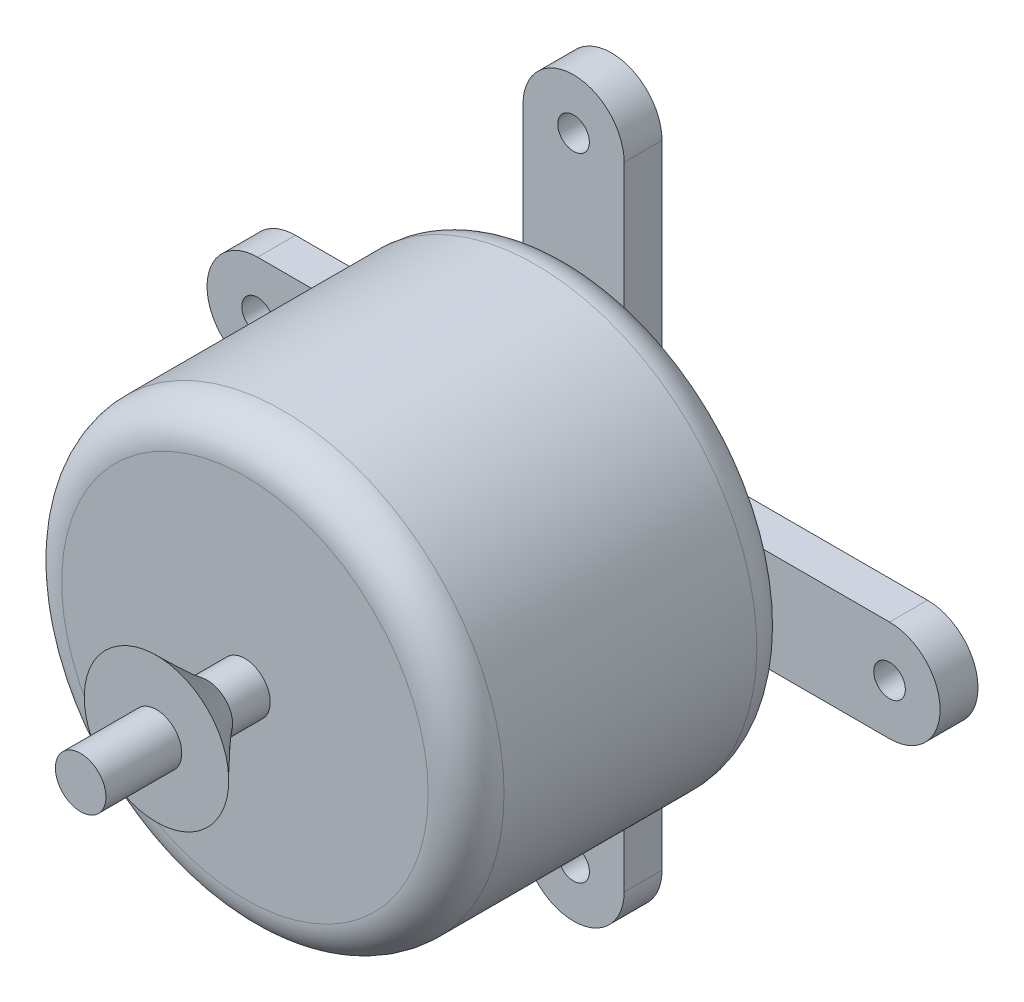
ISO-10303-21;
HEADER;
FILE_DESCRIPTION(('STEP AP214'),'2;1');
FILE_NAME('part.step','',(''),(''),'','','');
FILE_SCHEMA(('AUTOMOTIVE_DESIGN { 1 0 10303 214 1 1 1 1 }'));
ENDSEC;
DATA;
#1=APPLICATION_CONTEXT('core data for automotive mechanical design processes');
#2=APPLICATION_PROTOCOL_DEFINITION('international standard','automotive_design',2000,#1);
#3=PRODUCT_CONTEXT('',#1,'mechanical');
#4=PRODUCT('Part','Part','',(#3));
#5=PRODUCT_RELATED_PRODUCT_CATEGORY('part','',(#4));
#6=PRODUCT_DEFINITION_FORMATION('','',#4);
#7=PRODUCT_DEFINITION_CONTEXT('part definition',#1,'design');
#8=PRODUCT_DEFINITION('design','',#6,#7);
#9=PRODUCT_DEFINITION_SHAPE('','',#8);
#10=(LENGTH_UNIT() NAMED_UNIT(*) SI_UNIT(.MILLI.,.METRE.));
#11=(NAMED_UNIT(*) PLANE_ANGLE_UNIT() SI_UNIT($,.RADIAN.));
#12=(NAMED_UNIT(*) SI_UNIT($,.STERADIAN.) SOLID_ANGLE_UNIT());
#13=UNCERTAINTY_MEASURE_WITH_UNIT(LENGTH_MEASURE(1.E-05),#10,'distance_accuracy_value','');
#14=(GEOMETRIC_REPRESENTATION_CONTEXT(3) GLOBAL_UNCERTAINTY_ASSIGNED_CONTEXT((#13)) GLOBAL_UNIT_ASSIGNED_CONTEXT((#10,
#11,#12)) REPRESENTATION_CONTEXT('',''));
#15=CARTESIAN_POINT('',(0.,0.,0.));
#16=DIRECTION('',(0.,0.,1.));
#17=DIRECTION('',(1.,0.,0.));
#18=AXIS2_PLACEMENT_3D('',#15,#16,#17);
#19=CARTESIAN_POINT('',(0.,0.,0.));
#20=DIRECTION('',(0.,0.,1.));
#21=DIRECTION('',(1.,0.,0.));
#22=AXIS2_PLACEMENT_3D('',#19,#20,#21);
#23=PLANE('',#22);
#24=DIRECTION('',(-1.,0.,0.));
#25=VECTOR('',#24,1.);
#26=CARTESIAN_POINT('',(0.,-4.,0.));
#27=LINE('',#26,#25);
#28=CARTESIAN_POINT('',(-4.,-4.,0.));
#29=VERTEX_POINT('',#28);
#30=CARTESIAN_POINT('',(-13.9373598647664,-4.,0.));
#31=VERTEX_POINT('',#30);
#32=EDGE_CURVE('E184',#29,#31,#27,.T.);
#33=ORIENTED_EDGE('',*,*,#32,.F.);
#34=DIRECTION('',(0.,1.,0.));
#35=VECTOR('',#34,1.);
#36=CARTESIAN_POINT('',(-4.,0.,0.));
#37=LINE('',#36,#35);
#38=CARTESIAN_POINT('',(-4.,-13.9373598647664,0.));
#39=VERTEX_POINT('',#38);
#40=EDGE_CURVE('E272',#39,#29,#37,.T.);
#41=ORIENTED_EDGE('',*,*,#40,.F.);
#42=CARTESIAN_POINT('',(0.,0.,0.));
#43=DIRECTION('',(0.,0.,1.));
#44=DIRECTION('',(1.,0.,0.));
#45=AXIS2_PLACEMENT_3D('',#42,#43,#44);
#46=CIRCLE('',#45,14.5);
#47=EDGE_CURVE('E342',#39,#31,#46,.F.);
#48=ORIENTED_EDGE('',*,*,#47,.T.);
#49=EDGE_LOOP('',(#33,#41,#48));
#50=FACE_BOUND('',#49,.T.);
#51=ADVANCED_FACE('F39',(#50),#23,.F.);
#52=DIRECTION('',(1.,0.,0.));
#53=VECTOR('',#52,1.);
#54=CARTESIAN_POINT('',(0.,4.,0.));
#55=LINE('',#54,#53);
#56=CARTESIAN_POINT('',(-13.9373598647664,4.,0.));
#57=VERTEX_POINT('',#56);
#58=CARTESIAN_POINT('',(-4.,4.,0.));
#59=VERTEX_POINT('',#58);
#60=EDGE_CURVE('E54',#57,#59,#55,.T.);
#61=ORIENTED_EDGE('',*,*,#60,.F.);
#62=CARTESIAN_POINT('',(-4.,13.9373598647664,0.));
#63=VERTEX_POINT('',#62);
#64=EDGE_CURVE('E343',#57,#63,#46,.F.);
#65=ORIENTED_EDGE('',*,*,#64,.T.);
#66=EDGE_CURVE('E268',#59,#63,#37,.T.);
#67=ORIENTED_EDGE('',*,*,#66,.F.);
#68=EDGE_LOOP('',(#61,#65,#67));
#69=FACE_BOUND('',#68,.T.);
#70=ADVANCED_FACE('F366',(#69),#23,.F.);
#71=CARTESIAN_POINT('',(-4.,0.,-3.));
#72=DIRECTION('',(1.,0.,0.));
#73=DIRECTION('',(0.,1.,0.));
#74=AXIS2_PLACEMENT_3D('',#71,#72,#73);
#75=PLANE('',#74);
#76=DIRECTION('',(0.,0.,1.));
#77=VECTOR('',#76,1.);
#78=CARTESIAN_POINT('',(-4.,-4.,-3.));
#79=LINE('',#78,#77);
#80=CARTESIAN_POINT('',(-4.,-4.,-3.));
#81=VERTEX_POINT('',#80);
#82=EDGE_CURVE('E12',#81,#29,#79,.T.);
#83=ORIENTED_EDGE('',*,*,#82,.F.);
#84=DIRECTION('',(0.,1.,0.));
#85=VECTOR('',#84,1.);
#86=CARTESIAN_POINT('',(-4.,0.,-3.));
#87=LINE('',#86,#85);
#88=CARTESIAN_POINT('',(-4.,-25.,-3.));
#89=VERTEX_POINT('',#88);
#90=EDGE_CURVE('E160',#89,#81,#87,.T.);
#91=ORIENTED_EDGE('',*,*,#90,.F.);
#92=DIRECTION('',(0.,0.,1.));
#93=VECTOR('',#92,1.);
#94=CARTESIAN_POINT('',(-4.,-25.,-3.));
#95=LINE('',#94,#93);
#96=CARTESIAN_POINT('',(-4.,-25.,0.));
#97=VERTEX_POINT('',#96);
#98=EDGE_CURVE('E261',#89,#97,#95,.T.);
#99=ORIENTED_EDGE('',*,*,#98,.T.);
#100=EDGE_CURVE('E269',#97,#39,#37,.T.);
#101=ORIENTED_EDGE('',*,*,#100,.T.);
#102=ORIENTED_EDGE('',*,*,#40,.T.);
#103=EDGE_LOOP('',(#83,#91,#99,#101,#102));
#104=FACE_BOUND('',#103,.T.);
#105=ADVANCED_FACE('F370',(#104),#75,.F.);
#106=DIRECTION('',(0.,0.,-1.));
#107=VECTOR('',#106,1.);
#108=CARTESIAN_POINT('',(-4.,4.,-3.));
#109=LINE('',#108,#107);
#110=CARTESIAN_POINT('',(-4.,4.,-3.));
#111=VERTEX_POINT('',#110);
#112=EDGE_CURVE('E47',#59,#111,#109,.T.);
#113=ORIENTED_EDGE('',*,*,#112,.F.);
#114=ORIENTED_EDGE('',*,*,#66,.T.);
#115=DIRECTION('',(0.,1.,0.));
#116=VECTOR('',#115,1.);
#117=CARTESIAN_POINT('',(-4.,0.,0.));
#118=LINE('',#117,#116);
#119=CARTESIAN_POINT('',(-4.,25.,0.));
#120=VERTEX_POINT('',#119);
#121=EDGE_CURVE('E226',#63,#120,#118,.T.);
#122=ORIENTED_EDGE('',*,*,#121,.T.);
#123=DIRECTION('',(0.,0.,1.));
#124=VECTOR('',#123,1.);
#125=CARTESIAN_POINT('',(-4.,25.,-3.));
#126=LINE('',#125,#124);
#127=CARTESIAN_POINT('',(-4.,25.,-3.));
#128=VERTEX_POINT('',#127);
#129=EDGE_CURVE('E241',#128,#120,#126,.T.);
#130=ORIENTED_EDGE('',*,*,#129,.F.);
#131=EDGE_CURVE('E259',#111,#128,#87,.T.);
#132=ORIENTED_EDGE('',*,*,#131,.F.);
#133=EDGE_LOOP('',(#113,#114,#122,#130,#132));
#134=FACE_BOUND('',#133,.T.);
#135=ADVANCED_FACE('F363',(#134),#75,.F.);
#136=DIRECTION('',(1.,0.,0.));
#137=VECTOR('',#136,1.);
#138=CARTESIAN_POINT('',(0.,4.,0.));
#139=LINE('',#138,#137);
#140=CARTESIAN_POINT('',(4.,4.,0.));
#141=VERTEX_POINT('',#140);
#142=CARTESIAN_POINT('',(13.9373598647664,4.,0.));
#143=VERTEX_POINT('',#142);
#144=EDGE_CURVE('E208',#141,#143,#139,.T.);
#145=ORIENTED_EDGE('',*,*,#144,.F.);
#146=DIRECTION('',(0.,-1.,0.));
#147=VECTOR('',#146,1.);
#148=CARTESIAN_POINT('',(4.,0.,0.));
#149=LINE('',#148,#147);
#150=CARTESIAN_POINT('',(4.,13.9373598647664,0.));
#151=VERTEX_POINT('',#150);
#152=EDGE_CURVE('E262',#151,#141,#149,.T.);
#153=ORIENTED_EDGE('',*,*,#152,.F.);
#154=EDGE_CURVE('E374',#151,#143,#46,.F.);
#155=ORIENTED_EDGE('',*,*,#154,.T.);
#156=EDGE_LOOP('',(#145,#153,#155));
#157=FACE_BOUND('',#156,.T.);
#158=ADVANCED_FACE('F399',(#157),#23,.F.);
#159=DIRECTION('',(-1.,0.,0.));
#160=VECTOR('',#159,1.);
#161=CARTESIAN_POINT('',(0.,-4.,0.));
#162=LINE('',#161,#160);
#163=CARTESIAN_POINT('',(13.9373598647664,-4.,0.));
#164=VERTEX_POINT('',#163);
#165=CARTESIAN_POINT('',(4.,-4.,0.));
#166=VERTEX_POINT('',#165);
#167=EDGE_CURVE('E211',#164,#166,#162,.T.);
#168=ORIENTED_EDGE('',*,*,#167,.F.);
#169=CARTESIAN_POINT('',(4.,-13.9373598647664,0.));
#170=VERTEX_POINT('',#169);
#171=EDGE_CURVE('E337',#164,#170,#46,.F.);
#172=ORIENTED_EDGE('',*,*,#171,.T.);
#173=EDGE_CURVE('E266',#166,#170,#149,.T.);
#174=ORIENTED_EDGE('',*,*,#173,.F.);
#175=EDGE_LOOP('',(#168,#172,#174));
#176=FACE_BOUND('',#175,.T.);
#177=ADVANCED_FACE('F395',(#176),#23,.F.);
#178=CARTESIAN_POINT('',(4.,0.,-3.));
#179=DIRECTION('',(-1.,0.,0.));
#180=DIRECTION('',(0.,-1.,0.));
#181=AXIS2_PLACEMENT_3D('',#178,#179,#180);
#182=PLANE('',#181);
#183=DIRECTION('',(0.,0.,1.));
#184=VECTOR('',#183,1.);
#185=CARTESIAN_POINT('',(4.,4.,-3.));
#186=LINE('',#185,#184);
#187=CARTESIAN_POINT('',(4.,4.,-3.));
#188=VERTEX_POINT('',#187);
#189=EDGE_CURVE('E355',#188,#141,#186,.T.);
#190=ORIENTED_EDGE('',*,*,#189,.F.);
#191=DIRECTION('',(0.,-1.,0.));
#192=VECTOR('',#191,1.);
#193=CARTESIAN_POINT('',(4.,0.,-3.));
#194=LINE('',#193,#192);
#195=CARTESIAN_POINT('',(4.,25.,-3.));
#196=VERTEX_POINT('',#195);
#197=EDGE_CURVE('E254',#196,#188,#194,.T.);
#198=ORIENTED_EDGE('',*,*,#197,.F.);
#199=DIRECTION('',(0.,0.,1.));
#200=VECTOR('',#199,1.);
#201=CARTESIAN_POINT('',(4.,25.,-3.));
#202=LINE('',#201,#200);
#203=CARTESIAN_POINT('',(4.,25.,0.));
#204=VERTEX_POINT('',#203);
#205=EDGE_CURVE('E232',#196,#204,#202,.T.);
#206=ORIENTED_EDGE('',*,*,#205,.T.);
#207=DIRECTION('',(0.,-1.,0.));
#208=VECTOR('',#207,1.);
#209=CARTESIAN_POINT('',(4.,0.,0.));
#210=LINE('',#209,#208);
#211=EDGE_CURVE('E233',#204,#151,#210,.T.);
#212=ORIENTED_EDGE('',*,*,#211,.T.);
#213=ORIENTED_EDGE('',*,*,#152,.T.);
#214=EDGE_LOOP('',(#190,#198,#206,#212,#213));
#215=FACE_BOUND('',#214,.T.);
#216=ADVANCED_FACE('F402',(#215),#182,.F.);
#217=DIRECTION('',(0.,0.,-1.));
#218=VECTOR('',#217,1.);
#219=CARTESIAN_POINT('',(4.,-4.,-3.));
#220=LINE('',#219,#218);
#221=CARTESIAN_POINT('',(4.,-4.,-3.));
#222=VERTEX_POINT('',#221);
#223=EDGE_CURVE('E346',#166,#222,#220,.T.);
#224=ORIENTED_EDGE('',*,*,#223,.F.);
#225=ORIENTED_EDGE('',*,*,#173,.T.);
#226=CARTESIAN_POINT('',(4.,-25.,0.));
#227=VERTEX_POINT('',#226);
#228=EDGE_CURVE('E251',#170,#227,#149,.T.);
#229=ORIENTED_EDGE('',*,*,#228,.T.);
#230=DIRECTION('',(0.,0.,1.));
#231=VECTOR('',#230,1.);
#232=CARTESIAN_POINT('',(4.,-25.,-3.));
#233=LINE('',#232,#231);
#234=CARTESIAN_POINT('',(4.,-25.,-3.));
#235=VERTEX_POINT('',#234);
#236=EDGE_CURVE('E275',#235,#227,#233,.T.);
#237=ORIENTED_EDGE('',*,*,#236,.F.);
#238=EDGE_CURVE('E257',#222,#235,#194,.T.);
#239=ORIENTED_EDGE('',*,*,#238,.F.);
#240=EDGE_LOOP('',(#224,#225,#229,#237,#239));
#241=FACE_BOUND('',#240,.T.);
#242=ADVANCED_FACE('F408',(#241),#182,.F.);
#243=CARTESIAN_POINT('',(0.,0.,46.));
#244=DIRECTION('',(0.,0.,-1.));
#245=DIRECTION('',(-1.,0.,0.));
#246=AXIS2_PLACEMENT_3D('',#243,#244,#245);
#247=CYLINDRICAL_SURFACE('',#246,2.);
#248=CARTESIAN_POINT('',(0.,0.,33.));
#249=DIRECTION('',(0.,0.,1.));
#250=DIRECTION('',(1.,0.,0.));
#251=AXIS2_PLACEMENT_3D('',#248,#249,#250);
#252=CIRCLE('',#251,2.);
#253=CARTESIAN_POINT('',(2.,0.,33.));
#254=VERTEX_POINT('',#253);
#255=EDGE_CURVE('E331',#254,#254,#252,.T.);
#256=ORIENTED_EDGE('',*,*,#255,.T.);
#257=EDGE_LOOP('',(#256));
#258=FACE_BOUND('',#257,.T.);
#259=CARTESIAN_POINT('',(0.,0.,39.));
#260=DIRECTION('',(0.,0.,1.));
#261=DIRECTION('',(1.,0.,0.));
#262=AXIS2_PLACEMENT_3D('',#259,#260,#261);
#263=CIRCLE('',#262,2.);
#264=CARTESIAN_POINT('',(2.,0.,39.));
#265=VERTEX_POINT('',#264);
#266=EDGE_CURVE('E278',#265,#265,#263,.T.);
#267=ORIENTED_EDGE('',*,*,#266,.F.);
#268=EDGE_LOOP('',(#267));
#269=FACE_BOUND('',#268,.T.);
#270=ADVANCED_FACE('F516',(#258,#269),#247,.T.);
#271=CARTESIAN_POINT('',(0.,0.,26.));
#272=DIRECTION('',(0.,0.,1.));
#273=DIRECTION('',(1.,0.,0.));
#274=AXIS2_PLACEMENT_3D('',#271,#272,#273);
#275=PLANE('',#274);
#276=CARTESIAN_POINT('',(0.,0.,26.));
#277=DIRECTION('',(0.,0.,1.));
#278=DIRECTION('',(1.,0.,0.));
#279=AXIS2_PLACEMENT_3D('',#276,#277,#278);
#280=CIRCLE('',#279,14.5);
#281=CARTESIAN_POINT('',(14.5,0.,26.));
#282=VERTEX_POINT('',#281);
#283=EDGE_CURVE('E341',#282,#282,#280,.T.);
#284=ORIENTED_EDGE('',*,*,#283,.T.);
#285=EDGE_LOOP('',(#284));
#286=FACE_BOUND('',#285,.T.);
#287=CARTESIAN_POINT('',(0.,0.,26.));
#288=DIRECTION('',(0.,0.,1.));
#289=DIRECTION('',(1.,0.,0.));
#290=AXIS2_PLACEMENT_3D('',#287,#288,#289);
#291=CIRCLE('',#290,2.);
#292=CARTESIAN_POINT('',(2.,0.,26.));
#293=VERTEX_POINT('',#292);
#294=EDGE_CURVE('E327',#293,#293,#291,.T.);
#295=ORIENTED_EDGE('',*,*,#294,.F.);
#296=EDGE_LOOP('',(#295));
#297=FACE_BOUND('',#296,.T.);
#298=ADVANCED_FACE('F647',(#286,#297),#275,.T.);
#299=CARTESIAN_POINT('',(0.,0.,26.));
#300=DIRECTION('',(0.,0.,-1.));
#301=DIRECTION('',(-1.,0.,0.));
#302=AXIS2_PLACEMENT_3D('',#299,#300,#301);
#303=CYLINDRICAL_SURFACE('',#302,17.5);
#304=CARTESIAN_POINT('',(0.,0.,3.));
#305=DIRECTION('',(0.,0.,1.));
#306=DIRECTION('',(1.,0.,0.));
#307=AXIS2_PLACEMENT_3D('',#304,#305,#306);
#308=CIRCLE('',#307,17.5);
#309=CARTESIAN_POINT('',(-17.5,0.,3.));
#310=VERTEX_POINT('',#309);
#311=EDGE_CURVE('E334',#310,#310,#308,.T.);
#312=CARTESIAN_POINT('',(0.,0.,23.));
#313=DIRECTION('',(0.,0.,1.));
#314=DIRECTION('',(1.,0.,0.));
#315=AXIS2_PLACEMENT_3D('',#312,#313,#314);
#316=CIRCLE('',#315,17.5);
#317=CARTESIAN_POINT('',(-17.5,0.,23.));
#318=VERTEX_POINT('',#317);
#319=EDGE_CURVE('E330',#318,#318,#316,.F.);
#320=CARTESIAN_POINT('',(-17.5,0.,3.));
#321=CARTESIAN_POINT('',(-17.5,0.,3.20833333333333));
#322=CARTESIAN_POINT('',(-17.5,0.,3.41666666666666));
#323=CARTESIAN_POINT('',(-17.5,0.,3.83333333333333));
#324=CARTESIAN_POINT('',(-17.5,0.,4.04166666666666));
#325=CARTESIAN_POINT('',(-17.5,0.,4.45833333333333));
#326=CARTESIAN_POINT('',(-17.5,0.,4.66666666666666));
#327=CARTESIAN_POINT('',(-17.5,0.,5.08333333333333));
#328=CARTESIAN_POINT('',(-17.5,0.,5.29166666666666));
#329=CARTESIAN_POINT('',(-17.5,0.,5.70833333333333));
#330=CARTESIAN_POINT('',(-17.5,0.,5.91666666666666));
#331=CARTESIAN_POINT('',(-17.5,0.,6.33333333333333));
#332=CARTESIAN_POINT('',(-17.5,0.,6.54166666666666));
#333=CARTESIAN_POINT('',(-17.5,0.,6.95833333333333));
#334=CARTESIAN_POINT('',(-17.5,0.,7.16666666666666));
#335=CARTESIAN_POINT('',(-17.5,0.,7.58333333333333));
#336=CARTESIAN_POINT('',(-17.5,0.,7.79166666666666));
#337=CARTESIAN_POINT('',(-17.5,0.,8.20833333333333));
#338=CARTESIAN_POINT('',(-17.5,0.,8.41666666666666));
#339=CARTESIAN_POINT('',(-17.5,0.,8.83333333333333));
#340=CARTESIAN_POINT('',(-17.5,0.,9.04166666666666));
#341=CARTESIAN_POINT('',(-17.5,0.,9.45833333333333));
#342=CARTESIAN_POINT('',(-17.5,0.,9.66666666666666));
#343=CARTESIAN_POINT('',(-17.5,0.,10.0833333333333));
#344=CARTESIAN_POINT('',(-17.5,0.,10.2916666666667));
#345=CARTESIAN_POINT('',(-17.5,0.,10.7083333333333));
#346=CARTESIAN_POINT('',(-17.5,0.,10.9166666666667));
#347=CARTESIAN_POINT('',(-17.5,0.,11.3333333333333));
#348=CARTESIAN_POINT('',(-17.5,0.,11.5416666666667));
#349=CARTESIAN_POINT('',(-17.5,0.,11.9583333333333));
#350=CARTESIAN_POINT('',(-17.5,0.,12.1666666666667));
#351=CARTESIAN_POINT('',(-17.5,0.,12.5833333333333));
#352=CARTESIAN_POINT('',(-17.5,0.,12.7916666666667));
#353=CARTESIAN_POINT('',(-17.5,0.,13.2083333333333));
#354=CARTESIAN_POINT('',(-17.5,0.,13.4166666666667));
#355=CARTESIAN_POINT('',(-17.5,0.,13.8333333333333));
#356=CARTESIAN_POINT('',(-17.5,0.,14.0416666666667));
#357=CARTESIAN_POINT('',(-17.5,0.,14.4583333333333));
#358=CARTESIAN_POINT('',(-17.5,0.,14.6666666666667));
#359=CARTESIAN_POINT('',(-17.5,0.,15.0833333333333));
#360=CARTESIAN_POINT('',(-17.5,0.,15.2916666666667));
#361=CARTESIAN_POINT('',(-17.5,0.,15.7083333333333));
#362=CARTESIAN_POINT('',(-17.5,0.,15.9166666666667));
#363=CARTESIAN_POINT('',(-17.5,0.,16.3333333333333));
#364=CARTESIAN_POINT('',(-17.5,0.,16.5416666666667));
#365=CARTESIAN_POINT('',(-17.5,0.,16.9583333333333));
#366=CARTESIAN_POINT('',(-17.5,0.,17.1666666666667));
#367=CARTESIAN_POINT('',(-17.5,0.,17.5833333333333));
#368=CARTESIAN_POINT('',(-17.5,0.,17.7916666666667));
#369=CARTESIAN_POINT('',(-17.5,0.,18.2083333333333));
#370=CARTESIAN_POINT('',(-17.5,0.,18.4166666666667));
#371=CARTESIAN_POINT('',(-17.5,0.,18.8333333333333));
#372=CARTESIAN_POINT('',(-17.5,0.,19.0416666666667));
#373=CARTESIAN_POINT('',(-17.5,0.,19.4583333333333));
#374=CARTESIAN_POINT('',(-17.5,0.,19.6666666666667));
#375=CARTESIAN_POINT('',(-17.5,0.,20.0833333333333));
#376=CARTESIAN_POINT('',(-17.5,0.,20.2916666666667));
#377=CARTESIAN_POINT('',(-17.5,0.,20.7083333333333));
#378=CARTESIAN_POINT('',(-17.5,0.,20.9166666666667));
#379=CARTESIAN_POINT('',(-17.5,0.,21.3333333333333));
#380=CARTESIAN_POINT('',(-17.5,0.,21.5416666666667));
#381=CARTESIAN_POINT('',(-17.5,0.,21.9583333333333));
#382=CARTESIAN_POINT('',(-17.5,0.,22.1666666666667));
#383=CARTESIAN_POINT('',(-17.5,0.,22.5833333333333));
#384=CARTESIAN_POINT('',(-17.5,0.,22.7916666666667));
#385=CARTESIAN_POINT('',(-17.5,0.,23.));
#386=B_SPLINE_CURVE_WITH_KNOTS('',3,(#320,#321,#322,#323,#324,#325,#326,#327,#328,#329,#330,
#331,#332,#333,#334,#335,#336,#337,#338,#339,#340,#341,#342,#343,#344,#345,#346,#347,#348,#349,
#350,#351,#352,#353,#354,#355,#356,#357,#358,#359,#360,#361,#362,#363,#364,#365,#366,#367,#368,
#369,#370,#371,#372,#373,#374,#375,#376,#377,#378,#379,#380,#381,#382,#383,#384,#385),
.UNSPECIFIED.,.F.,.F.,(4,2,2,2,2,2,2,2,2,2,2,2,2,2,2,2,2,2,2,2,2,2,2,2,2,2,2,2,2,2,2,2,4),(0.,
0.625000000000001,1.25,1.875,2.5,3.125,3.75,4.375,5.,5.625,6.25,6.875,7.5,8.125,8.75,9.375,10.,
10.625,11.25,11.875,12.5,13.125,13.75,14.375,15.,15.625,16.25,16.875,17.5,18.125,18.75,19.375,
20.),.UNSPECIFIED.);
#387=EDGE_CURVE('BSEAM497',#310,#318,#386,.T.);
#388=ORIENTED_EDGE('',*,*,#311,.T.);
#389=ORIENTED_EDGE('',*,*,#319,.T.);
#390=ORIENTED_EDGE('',*,*,#387,.T.);
#391=ORIENTED_EDGE('',*,*,#387,.F.);
#392=EDGE_LOOP('',(#388,#390,#389,#391));
#393=FACE_BOUND('',#392,.T.);
#394=ADVANCED_FACE('F497',(#393),#303,.T.);
#395=CARTESIAN_POINT('',(0.,0.,3.));
#396=DIRECTION('',(0.,0.,1.));
#397=DIRECTION('',(1.,0.,0.));
#398=AXIS2_PLACEMENT_3D('',#395,#396,#397);
#399=TOROIDAL_SURFACE('',#398,14.5,3.);
#400=EDGE_CURVE('E338',#170,#39,#46,.F.);
#401=ORIENTED_EDGE('',*,*,#400,.F.);
#402=ORIENTED_EDGE('',*,*,#171,.F.);
#403=CARTESIAN_POINT('',(0.,0.,0.));
#404=DIRECTION('',(0.,0.,1.));
#405=DIRECTION('',(1.,0.,0.));
#406=AXIS2_PLACEMENT_3D('',#403,#404,#405);
#407=CIRCLE('',#406,14.5);
#408=EDGE_CURVE('E219',#143,#164,#407,.F.);
#409=ORIENTED_EDGE('',*,*,#408,.F.);
#410=ORIENTED_EDGE('',*,*,#154,.F.);
#411=CARTESIAN_POINT('',(0.,0.,0.));
#412=DIRECTION('',(0.,0.,1.));
#413=DIRECTION('',(1.,0.,0.));
#414=AXIS2_PLACEMENT_3D('',#411,#412,#413);
#415=CIRCLE('',#414,14.5);
#416=EDGE_CURVE('E244',#63,#151,#415,.F.);
#417=ORIENTED_EDGE('',*,*,#416,.F.);
#418=ORIENTED_EDGE('',*,*,#64,.F.);
#419=CARTESIAN_POINT('',(0.,0.,0.));
#420=DIRECTION('',(0.,0.,1.));
#421=DIRECTION('',(1.,0.,0.));
#422=AXIS2_PLACEMENT_3D('',#419,#420,#421);
#423=CIRCLE('',#422,14.5);
#424=EDGE_CURVE('E61',#31,#57,#423,.F.);
#425=ORIENTED_EDGE('',*,*,#424,.F.);
#426=ORIENTED_EDGE('',*,*,#47,.F.);
#427=EDGE_LOOP('',(#401,#402,#409,#410,#417,#418,#425,#426));
#428=FACE_BOUND('',#427,.T.);
#429=ORIENTED_EDGE('',*,*,#311,.F.);
#430=EDGE_LOOP('',(#429));
#431=FACE_BOUND('',#430,.T.);
#432=ADVANCED_FACE('F416',(#428,#431),#399,.T.);
#433=CARTESIAN_POINT('',(0.,0.,23.));
#434=DIRECTION('',(0.,0.,1.));
#435=DIRECTION('',(1.,0.,0.));
#436=AXIS2_PLACEMENT_3D('',#433,#434,#435);
#437=TOROIDAL_SURFACE('',#436,14.5,3.);
#438=ORIENTED_EDGE('',*,*,#319,.F.);
#439=EDGE_LOOP('',(#438));
#440=FACE_BOUND('',#439,.T.);
#441=ORIENTED_EDGE('',*,*,#283,.F.);
#442=EDGE_LOOP('',(#441));
#443=FACE_BOUND('',#442,.T.);
#444=ADVANCED_FACE('F41',(#440,#443),#437,.T.);
#445=CARTESIAN_POINT('',(0.,0.,28.9789752710223));
#446=DIRECTION('',(0.,0.,1.));
#447=DIRECTION('',(0.,-1.,0.));
#448=AXIS2_PLACEMENT_3D('',#445,#446,#447);
#449=CIRCLE('',#448,2.);
#450=CARTESIAN_POINT('',(1.2619262452545,1.55162564800208,28.9789752710223));
#451=VERTEX_POINT('',#450);
#452=EDGE_CURVE('E324',#451,#451,#449,.F.);
#453=ORIENTED_EDGE('',*,*,#452,.T.);
#454=EDGE_LOOP('',(#453));
#455=FACE_BOUND('',#454,.T.);
#456=ORIENTED_EDGE('',*,*,#294,.T.);
#457=EDGE_LOOP('',(#456));
#458=FACE_BOUND('',#457,.T.);
#459=ADVANCED_FACE('F312',(#455,#458),#247,.T.);
#460=CARTESIAN_POINT('',(0.,0.,33.));
#461=DIRECTION('',(0.,0.,1.));
#462=DIRECTION('',(1.,0.,0.));
#463=AXIS2_PLACEMENT_3D('',#460,#461,#462);
#464=PLANE('',#463);
#465=CARTESIAN_POINT('',(0.,0.,33.));
#466=DIRECTION('',(0.,0.,1.));
#467=DIRECTION('',(1.,0.,0.));
#468=AXIS2_PLACEMENT_3D('',#465,#466,#467);
#469=CIRCLE('',#468,5.71768387599712);
#470=CARTESIAN_POINT('',(5.26440268145528,2.23113722422532,33.));
#471=VERTEX_POINT('',#470);
#472=EDGE_CURVE('E283',#471,#471,#469,.T.);
#473=ORIENTED_EDGE('',*,*,#472,.T.);
#474=EDGE_LOOP('',(#473));
#475=FACE_BOUND('',#474,.T.);
#476=ORIENTED_EDGE('',*,*,#255,.F.);
#477=EDGE_LOOP('',(#476));
#478=FACE_BOUND('',#477,.T.);
#479=ADVANCED_FACE('F302',(#475,#478),#464,.T.);
#480=CARTESIAN_POINT('',(-1.70330752721302,1.04820964875327,26.));
#481=CARTESIAN_POINT('',(5.26440268145528,2.23113722422532,33.));
#482=CARTESIAN_POINT('',(-3.79972682471957,-2.35840540567278,26.));
#483=CARTESIAN_POINT('',(0.80212823300463,12.7599425871359,33.));
#484=CARTESIAN_POINT('',(-0.393111770293514,-4.45482470317932,26.));
#485=CARTESIAN_POINT('',(-9.72667712990592,8.29766813868523,33.));
#486=CARTESIAN_POINT('',(1.70330752721302,-1.04820964875327,26.));
#487=CARTESIAN_POINT('',(-5.26440268145528,-2.23113722422532,33.));
#488=CARTESIAN_POINT('',(3.79972682471956,2.35840540567278,26.));
#489=CARTESIAN_POINT('',(-0.802128233004633,-12.7599425871359,33.));
#490=CARTESIAN_POINT('',(0.393111770293511,4.45482470317932,26.));
#491=CARTESIAN_POINT('',(9.72667712990592,-8.29766813868523,33.));
#492=CARTESIAN_POINT('',(-1.70330752721302,1.04820964875327,26.));
#493=CARTESIAN_POINT('',(5.26440268145528,2.23113722422532,33.));
#494=(BOUNDED_SURFACE() B_SPLINE_SURFACE(3,1,((#480,#481),(#482,#483),(#484,#485),(#486,#487),
(#488,#489),(#490,#491),(#492,#493)),.UNSPECIFIED.,.T.,.F.,.F.) B_SPLINE_SURFACE_WITH_KNOTS((4,
3,4),(2,2),(0.,0.5,1.),(0.,1.),
.UNSPECIFIED.) GEOMETRIC_REPRESENTATION_ITEM() RATIONAL_B_SPLINE_SURFACE(((1.,1.),
(0.333333333333333,0.333333333333333),(0.333333333333333,0.333333333333333),(1.,1.),
(0.333333333333333,0.333333333333334),(0.333333333333333,0.333333333333334),(1.,1.))) REPRESENTATION_ITEM('') SURFACE());
#495=CARTESIAN_POINT('',(5.26440268145528,2.23113722422532,33.));
#496=CARTESIAN_POINT('',(5.22271021857819,2.22405897863967,32.9581143257398));
#497=CARTESIAN_POINT('',(5.1810177557011,2.21698073305401,32.9162286514796));
#498=CARTESIAN_POINT('',(5.09763282994691,2.20282424188269,32.8324573029593));
#499=CARTESIAN_POINT('',(5.05594036706982,2.19574599629703,32.7905716286991));
#500=CARTESIAN_POINT('',(4.97255544131564,2.18158950512571,32.7068002801787));
#501=CARTESIAN_POINT('',(4.93086297843855,2.17451125954005,32.6649146059185));
#502=CARTESIAN_POINT('',(4.84747805268436,2.16035476836874,32.5811432573982));
#503=CARTESIAN_POINT('',(4.80578558980727,2.15327652278308,32.539257583138));
#504=CARTESIAN_POINT('',(4.72240066405309,2.13912003161176,32.4554862346176));
#505=CARTESIAN_POINT('',(4.680708201176,2.1320417860261,32.4136005603574));
#506=CARTESIAN_POINT('',(4.59732327542182,2.11788529485478,32.3298292118371));
#507=CARTESIAN_POINT('',(4.55563081254472,2.11080704926912,32.2879435375769));
#508=CARTESIAN_POINT('',(4.47224588679054,2.09665055809781,32.2041721890565));
#509=CARTESIAN_POINT('',(4.43055342391345,2.08957231251215,32.1622865147963));
#510=CARTESIAN_POINT('',(4.34716849815927,2.07541582134083,32.078515166276));
#511=CARTESIAN_POINT('',(4.30547603528218,2.06833757575517,32.0366294920158));
#512=CARTESIAN_POINT('',(4.22209110952799,2.05418108458385,31.9528581434954));
#513=CARTESIAN_POINT('',(4.1803986466509,2.0471028389982,31.9109724692352));
#514=CARTESIAN_POINT('',(4.09701372089672,2.03294634782688,31.8272011207148));
#515=CARTESIAN_POINT('',(4.05532125801963,2.02586810224122,31.7853154464547));
#516=CARTESIAN_POINT('',(3.97193633226544,2.0117116110699,31.7015440979343));
#517=CARTESIAN_POINT('',(3.93024386938835,2.00463336548424,31.6596584236741));
#518=CARTESIAN_POINT('',(3.84685894363417,1.99047687431292,31.5758870751537));
#519=CARTESIAN_POINT('',(3.80516648075708,1.98339862872727,31.5340014008936));
#520=CARTESIAN_POINT('',(3.72178155500289,1.96924213755595,31.4502300523732));
#521=CARTESIAN_POINT('',(3.6800890921258,1.96216389197029,31.408344378113));
#522=CARTESIAN_POINT('',(3.59670416637162,1.94800740079897,31.3245730295926));
#523=CARTESIAN_POINT('',(3.55501170349453,1.94092915521331,31.2826873553325));
#524=CARTESIAN_POINT('',(3.47162677774035,1.926772664042,31.1989160068121));
#525=CARTESIAN_POINT('',(3.42993431486326,1.91969441845634,31.1570303325519));
#526=CARTESIAN_POINT('',(3.34654938910907,1.90553792728502,31.0732589840315));
#527=CARTESIAN_POINT('',(3.30485692623198,1.89845968169936,31.0313733097713));
#528=CARTESIAN_POINT('',(3.2214720004778,1.88430319052804,30.947601961251));
#529=CARTESIAN_POINT('',(3.17977953760071,1.87722494494238,30.9057162869908));
#530=CARTESIAN_POINT('',(3.09639461184652,1.86306845377107,30.8219449384704));
#531=CARTESIAN_POINT('',(3.05470214896943,1.85599020818541,30.7800592642102));
#532=CARTESIAN_POINT('',(2.97131722321525,1.84183371701409,30.6962879156899));
#533=CARTESIAN_POINT('',(2.92962476033816,1.83475547142843,30.6544022414297));
#534=CARTESIAN_POINT('',(2.84623983458398,1.82059898025711,30.5706308929093));
#535=CARTESIAN_POINT('',(2.80454737170688,1.81352073467145,30.5287452186491));
#536=CARTESIAN_POINT('',(2.7211624459527,1.79936424350014,30.4449738701288));
#537=CARTESIAN_POINT('',(2.67946998307561,1.79228599791448,30.4030881958686));
#538=CARTESIAN_POINT('',(2.59608505732143,1.77812950674316,30.3193168473482));
#539=CARTESIAN_POINT('',(2.55439259444434,1.7710512611575,30.277431173088));
#540=CARTESIAN_POINT('',(2.47100766869015,1.75689476998618,30.1936598245677));
#541=CARTESIAN_POINT('',(2.42931520581306,1.74981652440052,30.1517741503075));
#542=CARTESIAN_POINT('',(2.34593028005888,1.73566003322921,30.0680028017871));
#543=CARTESIAN_POINT('',(2.30423781718179,1.72858178764355,30.0261171275269));
#544=CARTESIAN_POINT('',(2.2208528914276,1.71442529647223,29.9423457790066));
#545=CARTESIAN_POINT('',(2.17916042855051,1.70734705088657,29.9004601047464));
#546=CARTESIAN_POINT('',(2.09577550279633,1.69319055971525,29.816688756226));
#547=CARTESIAN_POINT('',(2.05408303991924,1.68611231412959,29.7748030819658));
#548=CARTESIAN_POINT('',(1.97069811416505,1.67195582295828,29.6910317334455));
#549=CARTESIAN_POINT('',(1.92900565128796,1.66487757737262,29.6491460591853));
#550=CARTESIAN_POINT('',(1.84562072553378,1.6507210862013,29.5653747106649));
#551=CARTESIAN_POINT('',(1.80392826265669,1.64364284061564,29.5234890364047));
#552=CARTESIAN_POINT('',(1.72054333690251,1.62948634944432,29.4397176878843));
#553=CARTESIAN_POINT('',(1.67885087402541,1.62240810385866,29.3978320136242));
#554=CARTESIAN_POINT('',(1.59546594827123,1.60825161268735,29.3140606651038));
#555=CARTESIAN_POINT('',(1.55377348539414,1.60117336710169,29.2721749908436));
#556=CARTESIAN_POINT('',(1.47038855963996,1.58701687593037,29.1884036423232));
#557=CARTESIAN_POINT('',(1.42869609676287,1.57993863034471,29.1465179680631));
#558=CARTESIAN_POINT('',(1.34531117100868,1.56578213917339,29.0627466195427));
#559=CARTESIAN_POINT('',(1.30361870813159,1.55870389358774,29.0208609452825));
#560=CARTESIAN_POINT('',(1.2619262452545,1.55162564800208,28.9789752710223));
#561=B_SPLINE_CURVE_WITH_KNOTS('',3,(#495,#496,#497,#498,#499,#500,#501,#502,#503,#504,#505,
#506,#507,#508,#509,#510,#511,#512,#513,#514,#515,#516,#517,#518,#519,#520,#521,#522,#523,#524,
#525,#526,#527,#528,#529,#530,#531,#532,#533,#534,#535,#536,#537,#538,#539,#540,#541,#542,#543,
#544,#545,#546,#547,#548,#549,#550,#551,#552,#553,#554,#555,#556,#557,#558,#559,#560),
.UNSPECIFIED.,.F.,.F.,(4,2,2,2,2,2,2,2,2,2,2,2,2,2,2,2,2,2,2,2,2,2,2,2,2,2,2,2,2,2,2,2,4),(0.,
0.178563586898422,0.357127173796838,0.535690760695255,0.714254347593676,0.892817934492094,
1.07138152139051,1.24994510828893,1.42850869518735,1.60707228208577,1.78563586898419,
1.96419945588261,2.14276304278103,2.32132662967944,2.49989021657786,2.67845380347628,
2.8570173903747,3.03558097727312,3.21414456417154,3.39270815106996,3.57127173796838,
3.7498353248668,3.92839891176521,4.10696249866363,4.28552608556205,4.46408967246047,
4.64265325935889,4.82121684625731,4.99978043315573,5.17834402005415,5.35690760695257,
5.53547119385099,5.7140347807494),.UNSPECIFIED.);
#562=EDGE_CURVE('BSEAM289',#471,#451,#561,.T.);
#563=ORIENTED_EDGE('',*,*,#472,.F.);
#564=ORIENTED_EDGE('',*,*,#452,.F.);
#565=ORIENTED_EDGE('',*,*,#562,.T.);
#566=ORIENTED_EDGE('',*,*,#562,.F.);
#567=EDGE_LOOP('',(#563,#565,#564,#566));
#568=FACE_BOUND('',#567,.T.);
#569=ADVANCED_FACE('F289',(#568),#494,.T.);
#570=CARTESIAN_POINT('',(0.,0.,39.));
#571=DIRECTION('',(0.,0.,1.));
#572=DIRECTION('',(1.,0.,0.));
#573=AXIS2_PLACEMENT_3D('',#570,#571,#572);
#574=PLANE('',#573);
#575=ORIENTED_EDGE('',*,*,#266,.T.);
#576=EDGE_LOOP('',(#575));
#577=FACE_BOUND('',#576,.T.);
#578=ADVANCED_FACE('F301',(#577),#574,.T.);
#579=CARTESIAN_POINT('',(0.,0.,-3.));
#580=DIRECTION('',(0.,0.,-1.));
#581=DIRECTION('',(-1.,0.,0.));
#582=AXIS2_PLACEMENT_3D('',#579,#580,#581);
#583=PLANE('',#582);
#584=ORIENTED_EDGE('',*,*,#238,.T.);
#585=CARTESIAN_POINT('',(0.,-25.,-3.));
#586=DIRECTION('',(0.,0.,-1.));
#587=DIRECTION('',(-1.,0.,0.));
#588=AXIS2_PLACEMENT_3D('',#585,#586,#587);
#589=CIRCLE('',#588,4.);
#590=EDGE_CURVE('E256',#235,#89,#589,.T.);
#591=ORIENTED_EDGE('',*,*,#590,.T.);
#592=ORIENTED_EDGE('',*,*,#90,.T.);
#593=DIRECTION('',(-1.,0.,0.));
#594=VECTOR('',#593,1.);
#595=CARTESIAN_POINT('',(0.,-4.,-3.));
#596=LINE('',#595,#594);
#597=CARTESIAN_POINT('',(-25.,-4.,-3.));
#598=VERTEX_POINT('',#597);
#599=EDGE_CURVE('E152',#81,#598,#596,.T.);
#600=ORIENTED_EDGE('',*,*,#599,.T.);
#601=CARTESIAN_POINT('',(-25.,0.,-3.));
#602=DIRECTION('',(0.,0.,-1.));
#603=DIRECTION('',(-1.,0.,0.));
#604=AXIS2_PLACEMENT_3D('',#601,#602,#603);
#605=CIRCLE('',#604,4.);
#606=CARTESIAN_POINT('',(-25.,4.,-3.));
#607=VERTEX_POINT('',#606);
#608=EDGE_CURVE('E157',#598,#607,#605,.T.);
#609=ORIENTED_EDGE('',*,*,#608,.T.);
#610=DIRECTION('',(1.,0.,0.));
#611=VECTOR('',#610,1.);
#612=CARTESIAN_POINT('',(0.,4.,-3.));
#613=LINE('',#612,#611);
#614=EDGE_CURVE('E178',#607,#111,#613,.T.);
#615=ORIENTED_EDGE('',*,*,#614,.T.);
#616=ORIENTED_EDGE('',*,*,#131,.T.);
#617=CARTESIAN_POINT('',(0.,25.,-3.));
#618=DIRECTION('',(0.,0.,-1.));
#619=DIRECTION('',(-1.,0.,0.));
#620=AXIS2_PLACEMENT_3D('',#617,#618,#619);
#621=CIRCLE('',#620,4.);
#622=EDGE_CURVE('E229',#128,#196,#621,.T.);
#623=ORIENTED_EDGE('',*,*,#622,.T.);
#624=ORIENTED_EDGE('',*,*,#197,.T.);
#625=DIRECTION('',(1.,0.,0.));
#626=VECTOR('',#625,1.);
#627=CARTESIAN_POINT('',(0.,4.,-3.));
#628=LINE('',#627,#626);
#629=CARTESIAN_POINT('',(25.,4.,-3.));
#630=VERTEX_POINT('',#629);
#631=EDGE_CURVE('E199',#188,#630,#628,.T.);
#632=ORIENTED_EDGE('',*,*,#631,.T.);
#633=CARTESIAN_POINT('',(25.,0.,-3.));
#634=DIRECTION('',(0.,0.,-1.));
#635=DIRECTION('',(-1.,0.,0.));
#636=AXIS2_PLACEMENT_3D('',#633,#634,#635);
#637=CIRCLE('',#636,4.);
#638=CARTESIAN_POINT('',(25.,-4.,-3.));
#639=VERTEX_POINT('',#638);
#640=EDGE_CURVE('E201',#630,#639,#637,.T.);
#641=ORIENTED_EDGE('',*,*,#640,.T.);
#642=DIRECTION('',(-1.,0.,0.));
#643=VECTOR('',#642,1.);
#644=CARTESIAN_POINT('',(0.,-4.,-3.));
#645=LINE('',#644,#643);
#646=EDGE_CURVE('E204',#639,#222,#645,.T.);
#647=ORIENTED_EDGE('',*,*,#646,.T.);
#648=EDGE_LOOP('',(#584,#591,#592,#600,#609,#615,#616,#623,#624,#632,#641,#647));
#649=FACE_BOUND('',#648,.T.);
#650=CARTESIAN_POINT('',(-25.,0.,-3.));
#651=DIRECTION('',(0.,0.,-1.));
#652=DIRECTION('',(-1.,0.,0.));
#653=AXIS2_PLACEMENT_3D('',#650,#651,#652);
#654=CIRCLE('',#653,1.25);
#655=CARTESIAN_POINT('',(-26.25,0.,-3.));
#656=VERTEX_POINT('',#655);
#657=EDGE_CURVE('E185',#656,#656,#654,.T.);
#658=ORIENTED_EDGE('',*,*,#657,.F.);
#659=EDGE_LOOP('',(#658));
#660=FACE_BOUND('',#659,.T.);
#661=CARTESIAN_POINT('',(0.,25.,-3.));
#662=DIRECTION('',(0.,0.,-1.));
#663=DIRECTION('',(-1.,0.,0.));
#664=AXIS2_PLACEMENT_3D('',#661,#662,#663);
#665=CIRCLE('',#664,1.25);
#666=CARTESIAN_POINT('',(-1.25,25.,-3.));
#667=VERTEX_POINT('',#666);
#668=EDGE_CURVE('E223',#667,#667,#665,.T.);
#669=ORIENTED_EDGE('',*,*,#668,.F.);
#670=EDGE_LOOP('',(#669));
#671=FACE_BOUND('',#670,.T.);
#672=CARTESIAN_POINT('',(25.,0.,-3.));
#673=DIRECTION('',(0.,0.,-1.));
#674=DIRECTION('',(-1.,0.,0.));
#675=AXIS2_PLACEMENT_3D('',#672,#673,#674);
#676=CIRCLE('',#675,1.25);
#677=CARTESIAN_POINT('',(23.75,0.,-3.));
#678=VERTEX_POINT('',#677);
#679=EDGE_CURVE('E193',#678,#678,#676,.T.);
#680=ORIENTED_EDGE('',*,*,#679,.F.);
#681=EDGE_LOOP('',(#680));
#682=FACE_BOUND('',#681,.T.);
#683=CARTESIAN_POINT('',(0.,-25.,-3.));
#684=DIRECTION('',(0.,0.,-1.));
#685=DIRECTION('',(-1.,0.,0.));
#686=AXIS2_PLACEMENT_3D('',#683,#684,#685);
#687=CIRCLE('',#686,1.25);
#688=CARTESIAN_POINT('',(-1.25,-25.,-3.));
#689=VERTEX_POINT('',#688);
#690=EDGE_CURVE('E248',#689,#689,#687,.T.);
#691=ORIENTED_EDGE('',*,*,#690,.F.);
#692=EDGE_LOOP('',(#691));
#693=FACE_BOUND('',#692,.T.);
#694=ADVANCED_FACE('F154',(#649,#660,#671,#682,#693),#583,.T.);
#695=CARTESIAN_POINT('',(0.,0.,0.));
#696=DIRECTION('',(0.,0.,-1.));
#697=DIRECTION('',(-1.,0.,0.));
#698=AXIS2_PLACEMENT_3D('',#695,#696,#697);
#699=PLANE('',#698);
#700=CARTESIAN_POINT('',(0.,-25.,0.));
#701=DIRECTION('',(0.,0.,-1.));
#702=DIRECTION('',(-1.,0.,0.));
#703=AXIS2_PLACEMENT_3D('',#700,#701,#702);
#704=CIRCLE('',#703,1.25);
#705=CARTESIAN_POINT('',(-1.25,-25.,0.));
#706=VERTEX_POINT('',#705);
#707=EDGE_CURVE('E247',#706,#706,#704,.T.);
#708=ORIENTED_EDGE('',*,*,#707,.T.);
#709=EDGE_LOOP('',(#708));
#710=FACE_BOUND('',#709,.T.);
#711=ORIENTED_EDGE('',*,*,#228,.F.);
#712=ORIENTED_EDGE('',*,*,#400,.T.);
#713=ORIENTED_EDGE('',*,*,#100,.F.);
#714=CARTESIAN_POINT('',(0.,-25.,0.));
#715=DIRECTION('',(0.,0.,-1.));
#716=DIRECTION('',(-1.,0.,0.));
#717=AXIS2_PLACEMENT_3D('',#714,#715,#716);
#718=CIRCLE('',#717,4.);
#719=EDGE_CURVE('E265',#227,#97,#718,.T.);
#720=ORIENTED_EDGE('',*,*,#719,.F.);
#721=EDGE_LOOP('',(#711,#712,#713,#720));
#722=FACE_BOUND('',#721,.T.);
#723=ADVANCED_FACE('F455',(#710,#722),#699,.F.);
#724=CARTESIAN_POINT('',(0.,-25.,-3.));
#725=DIRECTION('',(0.,0.,1.));
#726=DIRECTION('',(1.,0.,0.));
#727=AXIS2_PLACEMENT_3D('',#724,#725,#726);
#728=CYLINDRICAL_SURFACE('',#727,4.);
#729=ORIENTED_EDGE('',*,*,#719,.T.);
#730=ORIENTED_EDGE('',*,*,#98,.F.);
#731=ORIENTED_EDGE('',*,*,#590,.F.);
#732=ORIENTED_EDGE('',*,*,#236,.T.);
#733=EDGE_LOOP('',(#729,#730,#731,#732));
#734=FACE_BOUND('',#733,.T.);
#735=ADVANCED_FACE('F453',(#734),#728,.T.);
#736=CARTESIAN_POINT('',(0.,-25.,-3.));
#737=DIRECTION('',(0.,0.,1.));
#738=DIRECTION('',(1.,0.,0.));
#739=AXIS2_PLACEMENT_3D('',#736,#737,#738);
#740=CYLINDRICAL_SURFACE('',#739,1.25);
#741=ORIENTED_EDGE('',*,*,#690,.T.);
#742=EDGE_LOOP('',(#741));
#743=FACE_BOUND('',#742,.T.);
#744=ORIENTED_EDGE('',*,*,#707,.F.);
#745=EDGE_LOOP('',(#744));
#746=FACE_BOUND('',#745,.T.);
#747=ADVANCED_FACE('F463',(#743,#746),#740,.F.);
#748=CARTESIAN_POINT('',(0.,0.,0.));
#749=DIRECTION('',(0.,0.,-1.));
#750=DIRECTION('',(-1.,0.,0.));
#751=AXIS2_PLACEMENT_3D('',#748,#749,#750);
#752=PLANE('',#751);
#753=CARTESIAN_POINT('',(0.,25.,0.));
#754=DIRECTION('',(0.,0.,-1.));
#755=DIRECTION('',(-1.,0.,0.));
#756=AXIS2_PLACEMENT_3D('',#753,#754,#755);
#757=CIRCLE('',#756,1.25);
#758=CARTESIAN_POINT('',(-1.25,25.,0.));
#759=VERTEX_POINT('',#758);
#760=EDGE_CURVE('E222',#759,#759,#757,.T.);
#761=ORIENTED_EDGE('',*,*,#760,.T.);
#762=EDGE_LOOP('',(#761));
#763=FACE_BOUND('',#762,.T.);
#764=ORIENTED_EDGE('',*,*,#121,.F.);
#765=ORIENTED_EDGE('',*,*,#416,.T.);
#766=ORIENTED_EDGE('',*,*,#211,.F.);
#767=CARTESIAN_POINT('',(0.,25.,0.));
#768=DIRECTION('',(0.,0.,-1.));
#769=DIRECTION('',(-1.,0.,0.));
#770=AXIS2_PLACEMENT_3D('',#767,#768,#769);
#771=CIRCLE('',#770,4.);
#772=EDGE_CURVE('E235',#120,#204,#771,.T.);
#773=ORIENTED_EDGE('',*,*,#772,.F.);
#774=EDGE_LOOP('',(#764,#765,#766,#773));
#775=FACE_BOUND('',#774,.T.);
#776=ADVANCED_FACE('F442',(#763,#775),#752,.F.);
#777=CARTESIAN_POINT('',(0.,25.,-3.));
#778=DIRECTION('',(0.,0.,1.));
#779=DIRECTION('',(1.,0.,0.));
#780=AXIS2_PLACEMENT_3D('',#777,#778,#779);
#781=CYLINDRICAL_SURFACE('',#780,4.);
#782=ORIENTED_EDGE('',*,*,#772,.T.);
#783=ORIENTED_EDGE('',*,*,#205,.F.);
#784=ORIENTED_EDGE('',*,*,#622,.F.);
#785=ORIENTED_EDGE('',*,*,#129,.T.);
#786=EDGE_LOOP('',(#782,#783,#784,#785));
#787=FACE_BOUND('',#786,.T.);
#788=ADVANCED_FACE('F445',(#787),#781,.T.);
#789=CARTESIAN_POINT('',(0.,25.,-3.));
#790=DIRECTION('',(0.,0.,1.));
#791=DIRECTION('',(1.,0.,0.));
#792=AXIS2_PLACEMENT_3D('',#789,#790,#791);
#793=CYLINDRICAL_SURFACE('',#792,1.25);
#794=ORIENTED_EDGE('',*,*,#668,.T.);
#795=EDGE_LOOP('',(#794));
#796=FACE_BOUND('',#795,.T.);
#797=ORIENTED_EDGE('',*,*,#760,.F.);
#798=EDGE_LOOP('',(#797));
#799=FACE_BOUND('',#798,.T.);
#800=ADVANCED_FACE('F606',(#796,#799),#793,.F.);
#801=CARTESIAN_POINT('',(0.,4.,-3.));
#802=DIRECTION('',(0.,-1.,0.));
#803=DIRECTION('',(1.,0.,0.));
#804=AXIS2_PLACEMENT_3D('',#801,#802,#803);
#805=PLANE('',#804);
#806=ORIENTED_EDGE('',*,*,#631,.F.);
#807=ORIENTED_EDGE('',*,*,#189,.T.);
#808=ORIENTED_EDGE('',*,*,#144,.T.);
#809=CARTESIAN_POINT('',(25.,4.,0.));
#810=VERTEX_POINT('',#809);
#811=EDGE_CURVE('E196',#143,#810,#139,.T.);
#812=ORIENTED_EDGE('',*,*,#811,.T.);
#813=DIRECTION('',(0.,0.,1.));
#814=VECTOR('',#813,1.);
#815=CARTESIAN_POINT('',(25.,4.,-3.));
#816=LINE('',#815,#814);
#817=EDGE_CURVE('E216',#630,#810,#816,.T.);
#818=ORIENTED_EDGE('',*,*,#817,.F.);
#819=EDGE_LOOP('',(#806,#807,#808,#812,#818));
#820=FACE_BOUND('',#819,.T.);
#821=ADVANCED_FACE('F435',(#820),#805,.F.);
#822=CARTESIAN_POINT('',(0.,-4.,-3.));
#823=DIRECTION('',(0.,1.,0.));
#824=DIRECTION('',(-1.,0.,0.));
#825=AXIS2_PLACEMENT_3D('',#822,#823,#824);
#826=PLANE('',#825);
#827=ORIENTED_EDGE('',*,*,#167,.T.);
#828=ORIENTED_EDGE('',*,*,#223,.T.);
#829=ORIENTED_EDGE('',*,*,#646,.F.);
#830=DIRECTION('',(0.,0.,1.));
#831=VECTOR('',#830,1.);
#832=CARTESIAN_POINT('',(25.,-4.,-3.));
#833=LINE('',#832,#831);
#834=CARTESIAN_POINT('',(25.,-4.,0.));
#835=VERTEX_POINT('',#834);
#836=EDGE_CURVE('E206',#639,#835,#833,.T.);
#837=ORIENTED_EDGE('',*,*,#836,.T.);
#838=EDGE_CURVE('E202',#835,#164,#162,.T.);
#839=ORIENTED_EDGE('',*,*,#838,.T.);
#840=EDGE_LOOP('',(#827,#828,#829,#837,#839));
#841=FACE_BOUND('',#840,.T.);
#842=ADVANCED_FACE('F427',(#841),#826,.F.);
#843=CARTESIAN_POINT('',(0.,0.,0.));
#844=DIRECTION('',(0.,0.,-1.));
#845=DIRECTION('',(-1.,0.,0.));
#846=AXIS2_PLACEMENT_3D('',#843,#844,#845);
#847=PLANE('',#846);
#848=CARTESIAN_POINT('',(25.,0.,0.));
#849=DIRECTION('',(0.,0.,-1.));
#850=DIRECTION('',(-1.,0.,0.));
#851=AXIS2_PLACEMENT_3D('',#848,#849,#850);
#852=CIRCLE('',#851,1.25);
#853=CARTESIAN_POINT('',(23.75,0.,0.));
#854=VERTEX_POINT('',#853);
#855=EDGE_CURVE('E192',#854,#854,#852,.T.);
#856=ORIENTED_EDGE('',*,*,#855,.T.);
#857=EDGE_LOOP('',(#856));
#858=FACE_BOUND('',#857,.T.);
#859=ORIENTED_EDGE('',*,*,#811,.F.);
#860=ORIENTED_EDGE('',*,*,#408,.T.);
#861=ORIENTED_EDGE('',*,*,#838,.F.);
#862=CARTESIAN_POINT('',(25.,0.,0.));
#863=DIRECTION('',(0.,0.,-1.));
#864=DIRECTION('',(-1.,0.,0.));
#865=AXIS2_PLACEMENT_3D('',#862,#863,#864);
#866=CIRCLE('',#865,4.);
#867=EDGE_CURVE('E209',#810,#835,#866,.T.);
#868=ORIENTED_EDGE('',*,*,#867,.F.);
#869=EDGE_LOOP('',(#859,#860,#861,#868));
#870=FACE_BOUND('',#869,.T.);
#871=ADVANCED_FACE('F424',(#858,#870),#847,.F.);
#872=CARTESIAN_POINT('',(25.,0.,-3.));
#873=DIRECTION('',(0.,0.,1.));
#874=DIRECTION('',(1.,0.,0.));
#875=AXIS2_PLACEMENT_3D('',#872,#873,#874);
#876=CYLINDRICAL_SURFACE('',#875,4.);
#877=ORIENTED_EDGE('',*,*,#867,.T.);
#878=ORIENTED_EDGE('',*,*,#836,.F.);
#879=ORIENTED_EDGE('',*,*,#640,.F.);
#880=ORIENTED_EDGE('',*,*,#817,.T.);
#881=EDGE_LOOP('',(#877,#878,#879,#880));
#882=FACE_BOUND('',#881,.T.);
#883=ADVANCED_FACE('F387',(#882),#876,.T.);
#884=CARTESIAN_POINT('',(25.,0.,-3.));
#885=DIRECTION('',(0.,0.,1.));
#886=DIRECTION('',(1.,0.,0.));
#887=AXIS2_PLACEMENT_3D('',#884,#885,#886);
#888=CYLINDRICAL_SURFACE('',#887,1.25);
#889=ORIENTED_EDGE('',*,*,#679,.T.);
#890=EDGE_LOOP('',(#889));
#891=FACE_BOUND('',#890,.T.);
#892=ORIENTED_EDGE('',*,*,#855,.F.);
#893=EDGE_LOOP('',(#892));
#894=FACE_BOUND('',#893,.T.);
#895=ADVANCED_FACE('F379',(#891,#894),#888,.F.);
#896=CARTESIAN_POINT('',(0.,0.,0.));
#897=DIRECTION('',(0.,0.,-1.));
#898=DIRECTION('',(-1.,0.,0.));
#899=AXIS2_PLACEMENT_3D('',#896,#897,#898);
#900=PLANE('',#899);
#901=CARTESIAN_POINT('',(-25.,0.,0.));
#902=DIRECTION('',(0.,0.,-1.));
#903=DIRECTION('',(-1.,0.,0.));
#904=AXIS2_PLACEMENT_3D('',#901,#902,#903);
#905=CIRCLE('',#904,1.25);
#906=CARTESIAN_POINT('',(-26.25,0.,0.));
#907=VERTEX_POINT('',#906);
#908=EDGE_CURVE('E808',#907,#907,#905,.T.);
#909=ORIENTED_EDGE('',*,*,#908,.T.);
#910=EDGE_LOOP('',(#909));
#911=FACE_BOUND('',#910,.T.);
#912=CARTESIAN_POINT('',(-25.,-4.,0.));
#913=VERTEX_POINT('',#912);
#914=EDGE_CURVE('E170',#31,#913,#27,.T.);
#915=ORIENTED_EDGE('',*,*,#914,.F.);
#916=ORIENTED_EDGE('',*,*,#424,.T.);
#917=CARTESIAN_POINT('',(-25.,4.,0.));
#918=VERTEX_POINT('',#917);
#919=EDGE_CURVE('E163',#918,#57,#55,.T.);
#920=ORIENTED_EDGE('',*,*,#919,.F.);
#921=CARTESIAN_POINT('',(-25.,0.,0.));
#922=DIRECTION('',(0.,0.,-1.));
#923=DIRECTION('',(-1.,0.,0.));
#924=AXIS2_PLACEMENT_3D('',#921,#922,#923);
#925=CIRCLE('',#924,4.);
#926=EDGE_CURVE('E186',#913,#918,#925,.T.);
#927=ORIENTED_EDGE('',*,*,#926,.F.);
#928=EDGE_LOOP('',(#915,#916,#920,#927));
#929=FACE_BOUND('',#928,.T.);
#930=ADVANCED_FACE('F376',(#911,#929),#900,.F.);
#931=CARTESIAN_POINT('',(0.,-4.,-3.));
#932=DIRECTION('',(0.,1.,0.));
#933=DIRECTION('',(0.,0.,1.));
#934=AXIS2_PLACEMENT_3D('',#931,#932,#933);
#935=PLANE('',#934);
#936=ORIENTED_EDGE('',*,*,#599,.F.);
#937=ORIENTED_EDGE('',*,*,#82,.T.);
#938=ORIENTED_EDGE('',*,*,#32,.T.);
#939=ORIENTED_EDGE('',*,*,#914,.T.);
#940=DIRECTION('',(0.,0.,1.));
#941=VECTOR('',#940,1.);
#942=CARTESIAN_POINT('',(-25.,-4.,-3.));
#943=LINE('',#942,#941);
#944=EDGE_CURVE('E166',#598,#913,#943,.T.);
#945=ORIENTED_EDGE('',*,*,#944,.F.);
#946=EDGE_LOOP('',(#936,#937,#938,#939,#945));
#947=FACE_BOUND('',#946,.T.);
#948=ADVANCED_FACE('F167',(#947),#935,.F.);
#949=CARTESIAN_POINT('',(0.,4.,-3.));
#950=DIRECTION('',(0.,-1.,0.));
#951=DIRECTION('',(0.,0.,-1.));
#952=AXIS2_PLACEMENT_3D('',#949,#950,#951);
#953=PLANE('',#952);
#954=ORIENTED_EDGE('',*,*,#60,.T.);
#955=ORIENTED_EDGE('',*,*,#112,.T.);
#956=ORIENTED_EDGE('',*,*,#614,.F.);
#957=DIRECTION('',(0.,0.,1.));
#958=VECTOR('',#957,1.);
#959=CARTESIAN_POINT('',(-25.,4.,-3.));
#960=LINE('',#959,#958);
#961=EDGE_CURVE('E173',#607,#918,#960,.T.);
#962=ORIENTED_EDGE('',*,*,#961,.T.);
#963=ORIENTED_EDGE('',*,*,#919,.T.);
#964=EDGE_LOOP('',(#954,#955,#956,#962,#963));
#965=FACE_BOUND('',#964,.T.);
#966=ADVANCED_FACE('F359',(#965),#953,.F.);
#967=CARTESIAN_POINT('',(-25.,0.,-3.));
#968=DIRECTION('',(0.,0.,1.));
#969=DIRECTION('',(1.,0.,0.));
#970=AXIS2_PLACEMENT_3D('',#967,#968,#969);
#971=CYLINDRICAL_SURFACE('',#970,4.);
#972=ORIENTED_EDGE('',*,*,#926,.T.);
#973=ORIENTED_EDGE('',*,*,#961,.F.);
#974=ORIENTED_EDGE('',*,*,#608,.F.);
#975=ORIENTED_EDGE('',*,*,#944,.T.);
#976=EDGE_LOOP('',(#972,#973,#974,#975));
#977=FACE_BOUND('',#976,.T.);
#978=ADVANCED_FACE('F175',(#977),#971,.T.);
#979=CARTESIAN_POINT('',(-25.,0.,-3.));
#980=DIRECTION('',(0.,0.,1.));
#981=DIRECTION('',(1.,0.,0.));
#982=AXIS2_PLACEMENT_3D('',#979,#980,#981);
#983=CYLINDRICAL_SURFACE('',#982,1.25);
#984=ORIENTED_EDGE('',*,*,#657,.T.);
#985=EDGE_LOOP('',(#984));
#986=FACE_BOUND('',#985,.T.);
#987=ORIENTED_EDGE('',*,*,#908,.F.);
#988=EDGE_LOOP('',(#987));
#989=FACE_BOUND('',#988,.T.);
#990=ADVANCED_FACE('F725',(#986,#989),#983,.F.);
#991=CLOSED_SHELL('',(#51,#70,#105,#135,#158,#177,#216,#242,#270,#298,#394,#432,#444,#459,#479,
#569,#578,#694,#723,#735,#747,#776,#788,#800,#821,#842,#871,#883,#895,#930,#948,#966,#978,#990));
#992=MANIFOLD_SOLID_BREP('B2',#991);
#993=ADVANCED_BREP_SHAPE_REPRESENTATION('',(#18,#992),#14);
#994=SHAPE_DEFINITION_REPRESENTATION(#9,#993);
ENDSEC;
END-ISO-10303-21;
